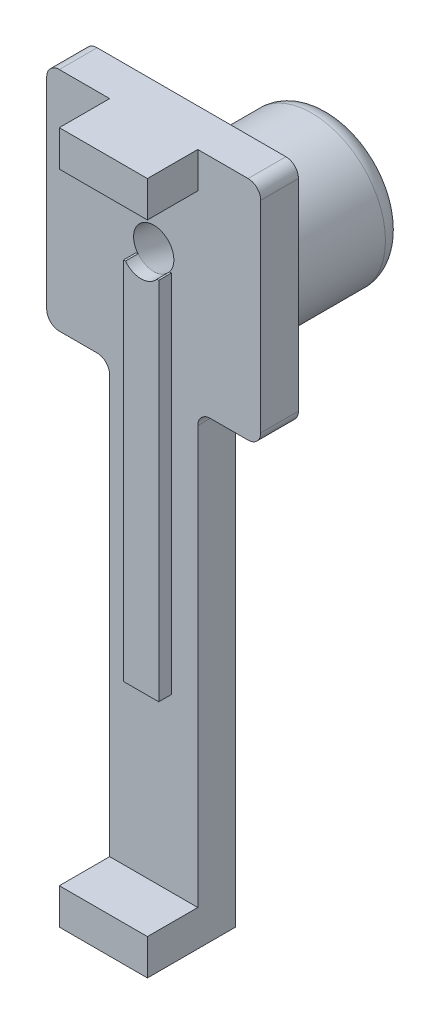
ISO-10303-21;
HEADER;
FILE_DESCRIPTION(('STEP AP214'),'2;1');
FILE_NAME('part.step','',(''),(''),'','','');
FILE_SCHEMA(('AUTOMOTIVE_DESIGN { 1 0 10303 214 1 1 1 1 }'));
ENDSEC;
DATA;
#1=APPLICATION_CONTEXT('core data for automotive mechanical design processes');
#2=APPLICATION_PROTOCOL_DEFINITION('international standard','automotive_design',2000,#1);
#3=PRODUCT_CONTEXT('',#1,'mechanical');
#4=PRODUCT('Part','Part','',(#3));
#5=PRODUCT_RELATED_PRODUCT_CATEGORY('part','',(#4));
#6=PRODUCT_DEFINITION_FORMATION('','',#4);
#7=PRODUCT_DEFINITION_CONTEXT('part definition',#1,'design');
#8=PRODUCT_DEFINITION('design','',#6,#7);
#9=PRODUCT_DEFINITION_SHAPE('','',#8);
#10=(LENGTH_UNIT() NAMED_UNIT(*) SI_UNIT(.MILLI.,.METRE.));
#11=(NAMED_UNIT(*) PLANE_ANGLE_UNIT() SI_UNIT($,.RADIAN.));
#12=(NAMED_UNIT(*) SI_UNIT($,.STERADIAN.) SOLID_ANGLE_UNIT());
#13=UNCERTAINTY_MEASURE_WITH_UNIT(LENGTH_MEASURE(1.E-05),#10,'distance_accuracy_value','');
#14=(GEOMETRIC_REPRESENTATION_CONTEXT(3) GLOBAL_UNCERTAINTY_ASSIGNED_CONTEXT((#13)) GLOBAL_UNIT_ASSIGNED_CONTEXT((#10,
#11,#12)) REPRESENTATION_CONTEXT('',''));
#15=CARTESIAN_POINT('',(0.,0.,0.));
#16=DIRECTION('',(0.,0.,1.));
#17=DIRECTION('',(1.,0.,0.));
#18=AXIS2_PLACEMENT_3D('',#15,#16,#17);
#19=CARTESIAN_POINT('',(1.4,26.9951042268699,4.));
#20=DIRECTION('',(0.,-1.,0.));
#21=DIRECTION('',(0.,0.,-1.));
#22=AXIS2_PLACEMENT_3D('',#19,#20,#21);
#23=PLANE('',#22);
#24=DIRECTION('',(-1.,0.,0.));
#25=VECTOR('',#24,1.);
#26=CARTESIAN_POINT('',(1.4,26.9951042268699,4.));
#27=LINE('',#26,#25);
#28=CARTESIAN_POINT('',(-1.24912299092202,26.9951042268699,4.));
#29=VERTEX_POINT('',#28);
#30=CARTESIAN_POINT('',(-1.4,26.9951042268699,4.));
#31=VERTEX_POINT('',#30);
#32=EDGE_CURVE('E244',#29,#31,#27,.T.);
#33=ORIENTED_EDGE('',*,*,#32,.F.);
#34=DIRECTION('',(0.,0.,-1.));
#35=VECTOR('',#34,1.);
#36=CARTESIAN_POINT('',(-1.24912299092202,26.9951042268699,13.));
#37=LINE('',#36,#35);
#38=CARTESIAN_POINT('',(-1.24912299092202,26.9951042268699,3.));
#39=VERTEX_POINT('',#38);
#40=EDGE_CURVE('E228',#29,#39,#37,.T.);
#41=ORIENTED_EDGE('',*,*,#40,.T.);
#42=DIRECTION('',(-1.,0.,0.));
#43=VECTOR('',#42,1.);
#44=CARTESIAN_POINT('',(1.4,26.9951042268699,3.));
#45=LINE('',#44,#43);
#46=CARTESIAN_POINT('',(-1.4,26.9951042268699,3.));
#47=VERTEX_POINT('',#46);
#48=EDGE_CURVE('E242',#39,#47,#45,.T.);
#49=ORIENTED_EDGE('',*,*,#48,.T.);
#50=DIRECTION('',(0.,0.,-1.));
#51=VECTOR('',#50,1.);
#52=CARTESIAN_POINT('',(-1.4,26.9951042268699,4.));
#53=LINE('',#52,#51);
#54=EDGE_CURVE('E285',#31,#47,#53,.T.);
#55=ORIENTED_EDGE('',*,*,#54,.F.);
#56=EDGE_LOOP('',(#33,#41,#49,#55));
#57=FACE_BOUND('',#56,.T.);
#58=ADVANCED_FACE('F50',(#57),#23,.F.);
#59=CARTESIAN_POINT('',(3.5,0.,3.));
#60=DIRECTION('',(-1.,0.,0.));
#61=DIRECTION('',(0.,0.,1.));
#62=AXIS2_PLACEMENT_3D('',#59,#60,#61);
#63=PLANE('',#62);
#64=DIRECTION('',(0.,1.,0.));
#65=VECTOR('',#64,1.);
#66=CARTESIAN_POINT('',(3.5,0.,0.));
#67=LINE('',#66,#65);
#68=CARTESIAN_POINT('',(3.5,-18.4548957731301,0.));
#69=VERTEX_POINT('',#68);
#70=CARTESIAN_POINT('',(3.5,17.5451042268699,0.));
#71=VERTEX_POINT('',#70);
#72=EDGE_CURVE('E304',#69,#71,#67,.T.);
#73=ORIENTED_EDGE('',*,*,#72,.T.);
#74=DIRECTION('',(0.,0.,-1.));
#75=VECTOR('',#74,1.);
#76=CARTESIAN_POINT('',(3.5,17.5451042268699,3.));
#77=LINE('',#76,#75);
#78=CARTESIAN_POINT('',(3.5,17.5451042268699,3.));
#79=VERTEX_POINT('',#78);
#80=EDGE_CURVE('E370',#71,#79,#77,.F.);
#81=ORIENTED_EDGE('',*,*,#80,.T.);
#82=DIRECTION('',(0.,1.,0.));
#83=VECTOR('',#82,1.);
#84=CARTESIAN_POINT('',(3.5,0.,3.));
#85=LINE('',#84,#83);
#86=CARTESIAN_POINT('',(3.5,-15.6048957731301,3.));
#87=VERTEX_POINT('',#86);
#88=EDGE_CURVE('E294',#87,#79,#85,.T.);
#89=ORIENTED_EDGE('',*,*,#88,.F.);
#90=DIRECTION('',(0.,0.,-1.));
#91=VECTOR('',#90,1.);
#92=CARTESIAN_POINT('',(3.5,-15.6048957731301,7.));
#93=LINE('',#92,#91);
#94=CARTESIAN_POINT('',(3.5,-15.6048957731301,7.));
#95=VERTEX_POINT('',#94);
#96=EDGE_CURVE('E610',#95,#87,#93,.T.);
#97=ORIENTED_EDGE('',*,*,#96,.F.);
#98=DIRECTION('',(0.,1.,0.));
#99=VECTOR('',#98,1.);
#100=CARTESIAN_POINT('',(3.5,-18.4548957731301,7.));
#101=LINE('',#100,#99);
#102=CARTESIAN_POINT('',(3.5,-18.4548957731301,7.));
#103=VERTEX_POINT('',#102);
#104=EDGE_CURVE('E594',#103,#95,#101,.T.);
#105=ORIENTED_EDGE('',*,*,#104,.F.);
#106=DIRECTION('',(0.,0.,-1.));
#107=VECTOR('',#106,1.);
#108=CARTESIAN_POINT('',(3.5,-18.4548957731301,3.));
#109=LINE('',#108,#107);
#110=EDGE_CURVE('E313',#103,#69,#109,.T.);
#111=ORIENTED_EDGE('',*,*,#110,.T.);
#112=EDGE_LOOP('',(#73,#81,#89,#97,#105,#111));
#113=FACE_BOUND('',#112,.T.);
#114=ADVANCED_FACE('F511',(#113),#63,.F.);
#115=DIRECTION('',(0.,-1.,0.));
#116=VECTOR('',#115,1.);
#117=CARTESIAN_POINT('',(3.5,36.5451042268699,3.));
#118=LINE('',#117,#116);
#119=CARTESIAN_POINT('',(3.5,36.5451042268699,3.));
#120=VERTEX_POINT('',#119);
#121=CARTESIAN_POINT('',(3.5,33.6951042268699,3.));
#122=VERTEX_POINT('',#121);
#123=EDGE_CURVE('E236',#120,#122,#118,.T.);
#124=ORIENTED_EDGE('',*,*,#123,.F.);
#125=DIRECTION('',(0.,0.,-1.));
#126=VECTOR('',#125,1.);
#127=CARTESIAN_POINT('',(3.5,36.5451042268699,3.));
#128=LINE('',#127,#126);
#129=CARTESIAN_POINT('',(3.5,36.5451042268699,7.));
#130=VERTEX_POINT('',#129);
#131=EDGE_CURVE('E310',#130,#120,#128,.T.);
#132=ORIENTED_EDGE('',*,*,#131,.F.);
#133=DIRECTION('',(0.,1.,0.));
#134=VECTOR('',#133,1.);
#135=CARTESIAN_POINT('',(3.5,36.5451042268699,7.));
#136=LINE('',#135,#134);
#137=CARTESIAN_POINT('',(3.5,33.6951042268699,7.));
#138=VERTEX_POINT('',#137);
#139=EDGE_CURVE('E619',#138,#130,#136,.T.);
#140=ORIENTED_EDGE('',*,*,#139,.F.);
#141=DIRECTION('',(0.,0.,-1.));
#142=VECTOR('',#141,1.);
#143=CARTESIAN_POINT('',(3.5,33.6951042268699,7.));
#144=LINE('',#143,#142);
#145=EDGE_CURVE('E625',#138,#122,#144,.T.);
#146=ORIENTED_EDGE('',*,*,#145,.T.);
#147=EDGE_LOOP('',(#124,#132,#140,#146));
#148=FACE_BOUND('',#147,.T.);
#149=ADVANCED_FACE('F515',(#148),#63,.F.);
#150=CARTESIAN_POINT('',(-3.5,0.,3.));
#151=DIRECTION('',(-1.,0.,0.));
#152=DIRECTION('',(0.,0.,1.));
#153=AXIS2_PLACEMENT_3D('',#150,#151,#152);
#154=PLANE('',#153);
#155=DIRECTION('',(0.,1.,0.));
#156=VECTOR('',#155,1.);
#157=CARTESIAN_POINT('',(-3.5,36.5451042268699,3.));
#158=LINE('',#157,#156);
#159=CARTESIAN_POINT('',(-3.5,33.6951042268699,3.));
#160=VERTEX_POINT('',#159);
#161=CARTESIAN_POINT('',(-3.5,36.5451042268699,3.));
#162=VERTEX_POINT('',#161);
#163=EDGE_CURVE('E317',#160,#162,#158,.T.);
#164=ORIENTED_EDGE('',*,*,#163,.F.);
#165=DIRECTION('',(0.,0.,-1.));
#166=VECTOR('',#165,1.);
#167=CARTESIAN_POINT('',(-3.5,33.6951042268699,7.));
#168=LINE('',#167,#166);
#169=CARTESIAN_POINT('',(-3.5,33.6951042268699,7.));
#170=VERTEX_POINT('',#169);
#171=EDGE_CURVE('E264',#170,#160,#168,.T.);
#172=ORIENTED_EDGE('',*,*,#171,.F.);
#173=DIRECTION('',(0.,-1.,0.));
#174=VECTOR('',#173,1.);
#175=CARTESIAN_POINT('',(-3.5,36.5451042268699,7.));
#176=LINE('',#175,#174);
#177=CARTESIAN_POINT('',(-3.5,36.5451042268699,7.));
#178=VERTEX_POINT('',#177);
#179=EDGE_CURVE('E614',#178,#170,#176,.T.);
#180=ORIENTED_EDGE('',*,*,#179,.F.);
#181=DIRECTION('',(0.,0.,-1.));
#182=VECTOR('',#181,1.);
#183=CARTESIAN_POINT('',(-3.5,36.5451042268699,3.));
#184=LINE('',#183,#182);
#185=EDGE_CURVE('E298',#178,#162,#184,.T.);
#186=ORIENTED_EDGE('',*,*,#185,.T.);
#187=EDGE_LOOP('',(#164,#172,#180,#186));
#188=FACE_BOUND('',#187,.T.);
#189=ADVANCED_FACE('F459',(#188),#154,.T.);
#190=CARTESIAN_POINT('',(0.,0.,3.));
#191=DIRECTION('',(0.,0.,1.));
#192=DIRECTION('',(1.,0.,0.));
#193=AXIS2_PLACEMENT_3D('',#190,#191,#192);
#194=PLANE('',#193);
#195=CARTESIAN_POINT('',(0.,27.9951042268699,3.));
#196=DIRECTION('',(0.,0.,1.));
#197=DIRECTION('',(1.,0.,0.));
#198=AXIS2_PLACEMENT_3D('',#195,#196,#197);
#199=CIRCLE('',#198,1.6);
#200=CARTESIAN_POINT('',(1.24876445430124,26.995104254588,3.));
#201=VERTEX_POINT('',#200);
#202=EDGE_CURVE('E54',#201,#39,#199,.T.);
#203=ORIENTED_EDGE('',*,*,#202,.F.);
#204=CARTESIAN_POINT('',(1.4,26.9951042268699,3.));
#205=VERTEX_POINT('',#204);
#206=EDGE_CURVE('E259',#205,#201,#45,.T.);
#207=ORIENTED_EDGE('',*,*,#206,.F.);
#208=DIRECTION('',(0.,1.,0.));
#209=VECTOR('',#208,1.);
#210=CARTESIAN_POINT('',(1.4,-2.00489577313014,3.));
#211=LINE('',#210,#209);
#212=CARTESIAN_POINT('',(1.4,-2.00489577313014,3.));
#213=VERTEX_POINT('',#212);
#214=EDGE_CURVE('E260',#213,#205,#211,.T.);
#215=ORIENTED_EDGE('',*,*,#214,.F.);
#216=DIRECTION('',(1.,0.,0.));
#217=VECTOR('',#216,1.);
#218=CARTESIAN_POINT('',(-1.4,-2.00489577313014,3.));
#219=LINE('',#218,#217);
#220=CARTESIAN_POINT('',(-1.4,-2.00489577313014,3.));
#221=VERTEX_POINT('',#220);
#222=EDGE_CURVE('E274',#221,#213,#219,.T.);
#223=ORIENTED_EDGE('',*,*,#222,.F.);
#224=DIRECTION('',(0.,-1.,0.));
#225=VECTOR('',#224,1.);
#226=CARTESIAN_POINT('',(-1.4,26.9951042268699,3.));
#227=LINE('',#226,#225);
#228=EDGE_CURVE('E257',#47,#221,#227,.T.);
#229=ORIENTED_EDGE('',*,*,#228,.F.);
#230=ORIENTED_EDGE('',*,*,#48,.F.);
#231=EDGE_LOOP('',(#203,#207,#215,#223,#229,#230));
#232=FACE_BOUND('',#231,.T.);
#233=DIRECTION('',(0.,1.,0.));
#234=VECTOR('',#233,1.);
#235=CARTESIAN_POINT('',(-8.5,36.5451042268699,3.));
#236=LINE('',#235,#234);
#237=CARTESIAN_POINT('',(-8.5,19.5451042268699,3.));
#238=VERTEX_POINT('',#237);
#239=CARTESIAN_POINT('',(-8.5,35.5451042268699,3.));
#240=VERTEX_POINT('',#239);
#241=EDGE_CURVE('E580',#238,#240,#236,.T.);
#242=ORIENTED_EDGE('',*,*,#241,.F.);
#243=CARTESIAN_POINT('',(-7.5,19.5451042268699,3.));
#244=DIRECTION('',(0.,0.,1.));
#245=DIRECTION('',(1.,0.,0.));
#246=AXIS2_PLACEMENT_3D('',#243,#244,#245);
#247=CIRCLE('',#246,1.);
#248=CARTESIAN_POINT('',(-7.5,18.5451042268699,3.));
#249=VERTEX_POINT('',#248);
#250=EDGE_CURVE('E346',#238,#249,#247,.T.);
#251=ORIENTED_EDGE('',*,*,#250,.T.);
#252=DIRECTION('',(1.,0.,0.));
#253=VECTOR('',#252,1.);
#254=CARTESIAN_POINT('',(-8.5,18.5451042268699,3.));
#255=LINE('',#254,#253);
#256=CARTESIAN_POINT('',(-4.5,18.5451042268699,3.));
#257=VERTEX_POINT('',#256);
#258=EDGE_CURVE('E587',#249,#257,#255,.T.);
#259=ORIENTED_EDGE('',*,*,#258,.T.);
#260=CARTESIAN_POINT('',(-4.5,17.5451042268699,3.));
#261=DIRECTION('',(0.,0.,1.));
#262=DIRECTION('',(1.,0.,0.));
#263=AXIS2_PLACEMENT_3D('',#260,#261,#262);
#264=CIRCLE('',#263,1.);
#265=CARTESIAN_POINT('',(-3.5,17.5451042268699,3.));
#266=VERTEX_POINT('',#265);
#267=EDGE_CURVE('E372',#257,#266,#264,.F.);
#268=ORIENTED_EDGE('',*,*,#267,.T.);
#269=DIRECTION('',(0.,1.,0.));
#270=VECTOR('',#269,1.);
#271=CARTESIAN_POINT('',(-3.5,0.,3.));
#272=LINE('',#271,#270);
#273=CARTESIAN_POINT('',(-3.5,-15.6048957731301,3.));
#274=VERTEX_POINT('',#273);
#275=EDGE_CURVE('E291',#274,#266,#272,.T.);
#276=ORIENTED_EDGE('',*,*,#275,.F.);
#277=DIRECTION('',(-1.,0.,0.));
#278=VECTOR('',#277,1.);
#279=CARTESIAN_POINT('',(3.5,-15.6048957731301,3.));
#280=LINE('',#279,#278);
#281=EDGE_CURVE('E593',#87,#274,#280,.T.);
#282=ORIENTED_EDGE('',*,*,#281,.F.);
#283=ORIENTED_EDGE('',*,*,#88,.T.);
#284=CARTESIAN_POINT('',(4.5,17.5451042268699,3.));
#285=DIRECTION('',(0.,0.,1.));
#286=DIRECTION('',(1.,0.,0.));
#287=AXIS2_PLACEMENT_3D('',#284,#285,#286);
#288=CIRCLE('',#287,1.);
#289=CARTESIAN_POINT('',(4.5,18.5451042268699,3.));
#290=VERTEX_POINT('',#289);
#291=EDGE_CURVE('E12',#79,#290,#288,.F.);
#292=ORIENTED_EDGE('',*,*,#291,.T.);
#293=DIRECTION('',(-1.,0.,0.));
#294=VECTOR('',#293,1.);
#295=CARTESIAN_POINT('',(8.5,18.5451042268699,3.));
#296=LINE('',#295,#294);
#297=CARTESIAN_POINT('',(7.5,18.5451042268699,3.));
#298=VERTEX_POINT('',#297);
#299=EDGE_CURVE('E564',#298,#290,#296,.T.);
#300=ORIENTED_EDGE('',*,*,#299,.F.);
#301=CARTESIAN_POINT('',(7.5,19.5451042268699,3.));
#302=DIRECTION('',(0.,0.,1.));
#303=DIRECTION('',(1.,0.,0.));
#304=AXIS2_PLACEMENT_3D('',#301,#302,#303);
#305=CIRCLE('',#304,1.);
#306=CARTESIAN_POINT('',(8.5,19.5451042268699,3.));
#307=VERTEX_POINT('',#306);
#308=EDGE_CURVE('E340',#298,#307,#305,.T.);
#309=ORIENTED_EDGE('',*,*,#308,.T.);
#310=DIRECTION('',(0.,-1.,0.));
#311=VECTOR('',#310,1.);
#312=CARTESIAN_POINT('',(8.5,36.5451042268699,3.));
#313=LINE('',#312,#311);
#314=CARTESIAN_POINT('',(8.5,35.5451042268699,3.));
#315=VERTEX_POINT('',#314);
#316=EDGE_CURVE('E562',#315,#307,#313,.T.);
#317=ORIENTED_EDGE('',*,*,#316,.F.);
#318=CARTESIAN_POINT('',(7.5,35.5451042268699,3.));
#319=DIRECTION('',(0.,0.,1.));
#320=DIRECTION('',(1.,0.,0.));
#321=AXIS2_PLACEMENT_3D('',#318,#319,#320);
#322=CIRCLE('',#321,1.);
#323=CARTESIAN_POINT('',(7.5,36.5451042268699,3.));
#324=VERTEX_POINT('',#323);
#325=EDGE_CURVE('E342',#315,#324,#322,.T.);
#326=ORIENTED_EDGE('',*,*,#325,.T.);
#327=DIRECTION('',(-1.,0.,0.));
#328=VECTOR('',#327,1.);
#329=CARTESIAN_POINT('',(8.5,36.5451042268699,3.));
#330=LINE('',#329,#328);
#331=EDGE_CURVE('E575',#324,#120,#330,.T.);
#332=ORIENTED_EDGE('',*,*,#331,.T.);
#333=ORIENTED_EDGE('',*,*,#123,.T.);
#334=DIRECTION('',(1.,0.,0.));
#335=VECTOR('',#334,1.);
#336=CARTESIAN_POINT('',(-3.5,33.6951042268699,3.));
#337=LINE('',#336,#335);
#338=EDGE_CURVE('E613',#160,#122,#337,.T.);
#339=ORIENTED_EDGE('',*,*,#338,.F.);
#340=ORIENTED_EDGE('',*,*,#163,.T.);
#341=DIRECTION('',(1.,0.,0.));
#342=VECTOR('',#341,1.);
#343=CARTESIAN_POINT('',(-8.5,36.5451042268699,3.));
#344=LINE('',#343,#342);
#345=CARTESIAN_POINT('',(-7.5,36.5451042268699,3.));
#346=VERTEX_POINT('',#345);
#347=EDGE_CURVE('E583',#346,#162,#344,.T.);
#348=ORIENTED_EDGE('',*,*,#347,.F.);
#349=CARTESIAN_POINT('',(-7.5,35.5451042268699,3.));
#350=DIRECTION('',(0.,0.,1.));
#351=DIRECTION('',(1.,0.,0.));
#352=AXIS2_PLACEMENT_3D('',#349,#350,#351);
#353=CIRCLE('',#352,1.);
#354=EDGE_CURVE('E344',#346,#240,#353,.T.);
#355=ORIENTED_EDGE('',*,*,#354,.T.);
#356=EDGE_LOOP('',(#242,#251,#259,#268,#276,#282,#283,#292,#300,#309,#317,#326,#332,#333,#339,
#340,#348,#355));
#357=FACE_BOUND('',#356,.T.);
#358=ADVANCED_FACE('F254',(#232,#357),#194,.T.);
#359=ORIENTED_EDGE('',*,*,#275,.T.);
#360=DIRECTION('',(0.,0.,1.));
#361=VECTOR('',#360,1.);
#362=CARTESIAN_POINT('',(-3.5,17.5451042268699,2.99999999999998));
#363=LINE('',#362,#361);
#364=CARTESIAN_POINT('',(-3.5,17.5451042268699,0.));
#365=VERTEX_POINT('',#364);
#366=EDGE_CURVE('E332',#266,#365,#363,.F.);
#367=ORIENTED_EDGE('',*,*,#366,.T.);
#368=DIRECTION('',(0.,1.,0.));
#369=VECTOR('',#368,1.);
#370=CARTESIAN_POINT('',(-3.5,0.,0.));
#371=LINE('',#370,#369);
#372=CARTESIAN_POINT('',(-3.5,-18.4548957731301,0.));
#373=VERTEX_POINT('',#372);
#374=EDGE_CURVE('E290',#373,#365,#371,.T.);
#375=ORIENTED_EDGE('',*,*,#374,.F.);
#376=DIRECTION('',(0.,0.,-1.));
#377=VECTOR('',#376,1.);
#378=CARTESIAN_POINT('',(-3.5,-18.4548957731301,3.));
#379=LINE('',#378,#377);
#380=CARTESIAN_POINT('',(-3.5,-18.4548957731301,7.));
#381=VERTEX_POINT('',#380);
#382=EDGE_CURVE('E315',#381,#373,#379,.T.);
#383=ORIENTED_EDGE('',*,*,#382,.F.);
#384=DIRECTION('',(0.,-1.,0.));
#385=VECTOR('',#384,1.);
#386=CARTESIAN_POINT('',(-3.5,-18.4548957731301,7.));
#387=LINE('',#386,#385);
#388=CARTESIAN_POINT('',(-3.5,-15.6048957731301,7.));
#389=VERTEX_POINT('',#388);
#390=EDGE_CURVE('E599',#389,#381,#387,.T.);
#391=ORIENTED_EDGE('',*,*,#390,.F.);
#392=DIRECTION('',(0.,0.,-1.));
#393=VECTOR('',#392,1.);
#394=CARTESIAN_POINT('',(-3.5,-15.6048957731301,7.));
#395=LINE('',#394,#393);
#396=EDGE_CURVE('E605',#389,#274,#395,.T.);
#397=ORIENTED_EDGE('',*,*,#396,.T.);
#398=EDGE_LOOP('',(#359,#367,#375,#383,#391,#397));
#399=FACE_BOUND('',#398,.T.);
#400=ADVANCED_FACE('F458',(#399),#154,.T.);
#401=CARTESIAN_POINT('',(0.,-18.4548957731301,3.));
#402=DIRECTION('',(0.,-1.,0.));
#403=DIRECTION('',(0.,0.,-1.));
#404=AXIS2_PLACEMENT_3D('',#401,#402,#403);
#405=PLANE('',#404);
#406=DIRECTION('',(-1.,0.,0.));
#407=VECTOR('',#406,1.);
#408=CARTESIAN_POINT('',(0.,-18.4548957731301,0.));
#409=LINE('',#408,#407);
#410=EDGE_CURVE('E301',#69,#373,#409,.T.);
#411=ORIENTED_EDGE('',*,*,#410,.F.);
#412=ORIENTED_EDGE('',*,*,#110,.F.);
#413=DIRECTION('',(1.,0.,0.));
#414=VECTOR('',#413,1.);
#415=CARTESIAN_POINT('',(3.5,-18.4548957731301,7.));
#416=LINE('',#415,#414);
#417=EDGE_CURVE('E602',#381,#103,#416,.T.);
#418=ORIENTED_EDGE('',*,*,#417,.F.);
#419=ORIENTED_EDGE('',*,*,#382,.T.);
#420=EDGE_LOOP('',(#411,#412,#418,#419));
#421=FACE_BOUND('',#420,.T.);
#422=ADVANCED_FACE('F524',(#421),#405,.T.);
#423=CARTESIAN_POINT('',(0.,36.5451042268699,3.));
#424=DIRECTION('',(0.,-1.,0.));
#425=DIRECTION('',(0.,0.,-1.));
#426=AXIS2_PLACEMENT_3D('',#423,#424,#425);
#427=PLANE('',#426);
#428=DIRECTION('',(-1.,0.,0.));
#429=VECTOR('',#428,1.);
#430=CARTESIAN_POINT('',(0.,36.5451042268699,0.));
#431=LINE('',#430,#429);
#432=CARTESIAN_POINT('',(7.5,36.5451042268699,0.));
#433=VERTEX_POINT('',#432);
#434=CARTESIAN_POINT('',(-7.5,36.5451042268699,0.));
#435=VERTEX_POINT('',#434);
#436=EDGE_CURVE('E295',#433,#435,#431,.T.);
#437=ORIENTED_EDGE('',*,*,#436,.T.);
#438=DIRECTION('',(0.,0.,-1.));
#439=VECTOR('',#438,1.);
#440=CARTESIAN_POINT('',(-7.5,36.5451042268699,3.));
#441=LINE('',#440,#439);
#442=EDGE_CURVE('E358',#435,#346,#441,.F.);
#443=ORIENTED_EDGE('',*,*,#442,.T.);
#444=ORIENTED_EDGE('',*,*,#347,.T.);
#445=ORIENTED_EDGE('',*,*,#185,.F.);
#446=DIRECTION('',(-1.,0.,0.));
#447=VECTOR('',#446,1.);
#448=CARTESIAN_POINT('',(-3.5,36.5451042268699,7.));
#449=LINE('',#448,#447);
#450=EDGE_CURVE('E622',#130,#178,#449,.T.);
#451=ORIENTED_EDGE('',*,*,#450,.F.);
#452=ORIENTED_EDGE('',*,*,#131,.T.);
#453=ORIENTED_EDGE('',*,*,#331,.F.);
#454=DIRECTION('',(0.,0.,1.));
#455=VECTOR('',#454,1.);
#456=CARTESIAN_POINT('',(7.5,36.5451042268699,0.));
#457=LINE('',#456,#455);
#458=EDGE_CURVE('E356',#324,#433,#457,.F.);
#459=ORIENTED_EDGE('',*,*,#458,.T.);
#460=EDGE_LOOP('',(#437,#443,#444,#445,#451,#452,#453,#459));
#461=FACE_BOUND('',#460,.T.);
#462=ADVANCED_FACE('F523',(#461),#427,.F.);
#463=CARTESIAN_POINT('',(0.,0.,0.));
#464=DIRECTION('',(0.,0.,1.));
#465=DIRECTION('',(1.,0.,0.));
#466=AXIS2_PLACEMENT_3D('',#463,#464,#465);
#467=PLANE('',#466);
#468=CARTESIAN_POINT('',(0.,25.1701042268699,0.));
#469=DIRECTION('',(0.,0.,1.));
#470=DIRECTION('',(1.,0.,0.));
#471=AXIS2_PLACEMENT_3D('',#468,#469,#470);
#472=CIRCLE('',#471,5.85);
#473=CARTESIAN_POINT('',(5.85,25.1701042268699,0.));
#474=VERTEX_POINT('',#473);
#475=EDGE_CURVE('E318',#474,#474,#472,.F.);
#476=ORIENTED_EDGE('',*,*,#475,.F.);
#477=EDGE_LOOP('',(#476));
#478=FACE_BOUND('',#477,.T.);
#479=DIRECTION('',(1.,0.,0.));
#480=VECTOR('',#479,1.);
#481=CARTESIAN_POINT('',(-8.5,18.5451042268699,0.));
#482=LINE('',#481,#480);
#483=CARTESIAN_POINT('',(-7.5,18.5451042268699,0.));
#484=VERTEX_POINT('',#483);
#485=CARTESIAN_POINT('',(-4.5,18.5451042268699,0.));
#486=VERTEX_POINT('',#485);
#487=EDGE_CURVE('E590',#484,#486,#482,.T.);
#488=ORIENTED_EDGE('',*,*,#487,.F.);
#489=CARTESIAN_POINT('',(-7.5,19.5451042268699,0.));
#490=DIRECTION('',(0.,0.,1.));
#491=DIRECTION('',(1.,0.,0.));
#492=AXIS2_PLACEMENT_3D('',#489,#490,#491);
#493=CIRCLE('',#492,1.);
#494=CARTESIAN_POINT('',(-8.5,19.5451042268699,0.));
#495=VERTEX_POINT('',#494);
#496=EDGE_CURVE('E354',#484,#495,#493,.F.);
#497=ORIENTED_EDGE('',*,*,#496,.T.);
#498=DIRECTION('',(0.,-1.,0.));
#499=VECTOR('',#498,1.);
#500=CARTESIAN_POINT('',(-8.5,36.5451042268699,0.));
#501=LINE('',#500,#499);
#502=CARTESIAN_POINT('',(-8.5,35.5451042268699,0.));
#503=VERTEX_POINT('',#502);
#504=EDGE_CURVE('E577',#503,#495,#501,.T.);
#505=ORIENTED_EDGE('',*,*,#504,.F.);
#506=CARTESIAN_POINT('',(-7.5,35.5451042268699,0.));
#507=DIRECTION('',(0.,0.,1.));
#508=DIRECTION('',(1.,0.,0.));
#509=AXIS2_PLACEMENT_3D('',#506,#507,#508);
#510=CIRCLE('',#509,1.);
#511=EDGE_CURVE('E352',#503,#435,#510,.F.);
#512=ORIENTED_EDGE('',*,*,#511,.T.);
#513=ORIENTED_EDGE('',*,*,#436,.F.);
#514=CARTESIAN_POINT('',(7.5,35.5451042268699,0.));
#515=DIRECTION('',(0.,0.,1.));
#516=DIRECTION('',(1.,0.,0.));
#517=AXIS2_PLACEMENT_3D('',#514,#515,#516);
#518=CIRCLE('',#517,1.);
#519=CARTESIAN_POINT('',(8.5,35.5451042268699,0.));
#520=VERTEX_POINT('',#519);
#521=EDGE_CURVE('E350',#433,#520,#518,.F.);
#522=ORIENTED_EDGE('',*,*,#521,.T.);
#523=DIRECTION('',(0.,1.,0.));
#524=VECTOR('',#523,1.);
#525=CARTESIAN_POINT('',(8.5,18.5451042268699,0.));
#526=LINE('',#525,#524);
#527=CARTESIAN_POINT('',(8.5,19.5451042268699,0.));
#528=VERTEX_POINT('',#527);
#529=EDGE_CURVE('E569',#528,#520,#526,.T.);
#530=ORIENTED_EDGE('',*,*,#529,.F.);
#531=CARTESIAN_POINT('',(7.5,19.5451042268699,0.));
#532=DIRECTION('',(0.,0.,1.));
#533=DIRECTION('',(1.,0.,0.));
#534=AXIS2_PLACEMENT_3D('',#531,#532,#533);
#535=CIRCLE('',#534,1.);
#536=CARTESIAN_POINT('',(7.5,18.5451042268699,0.));
#537=VERTEX_POINT('',#536);
#538=EDGE_CURVE('E348',#528,#537,#535,.F.);
#539=ORIENTED_EDGE('',*,*,#538,.T.);
#540=DIRECTION('',(-1.,0.,0.));
#541=VECTOR('',#540,1.);
#542=CARTESIAN_POINT('',(8.5,18.5451042268699,0.));
#543=LINE('',#542,#541);
#544=CARTESIAN_POINT('',(4.5,18.5451042268699,0.));
#545=VERTEX_POINT('',#544);
#546=EDGE_CURVE('E568',#537,#545,#543,.T.);
#547=ORIENTED_EDGE('',*,*,#546,.T.);
#548=CARTESIAN_POINT('',(4.5,17.5451042268699,0.));
#549=DIRECTION('',(0.,0.,1.));
#550=DIRECTION('',(1.,0.,0.));
#551=AXIS2_PLACEMENT_3D('',#548,#549,#550);
#552=CIRCLE('',#551,1.);
#553=EDGE_CURVE('E60',#545,#71,#552,.T.);
#554=ORIENTED_EDGE('',*,*,#553,.T.);
#555=ORIENTED_EDGE('',*,*,#72,.F.);
#556=ORIENTED_EDGE('',*,*,#410,.T.);
#557=ORIENTED_EDGE('',*,*,#374,.T.);
#558=CARTESIAN_POINT('',(-4.5,17.5451042268699,0.));
#559=DIRECTION('',(0.,0.,1.));
#560=DIRECTION('',(1.,0.,0.));
#561=AXIS2_PLACEMENT_3D('',#558,#559,#560);
#562=CIRCLE('',#561,1.);
#563=EDGE_CURVE('E374',#365,#486,#562,.T.);
#564=ORIENTED_EDGE('',*,*,#563,.T.);
#565=EDGE_LOOP('',(#488,#497,#505,#512,#513,#522,#530,#539,#547,#554,#555,#556,#557,#564));
#566=FACE_BOUND('',#565,.T.);
#567=ADVANCED_FACE('F453',(#478,#566),#467,.F.);
#568=CARTESIAN_POINT('',(1.4,-2.00489577313014,4.));
#569=DIRECTION('',(-1.,0.,0.));
#570=DIRECTION('',(0.,-1.,0.));
#571=AXIS2_PLACEMENT_3D('',#568,#569,#570);
#572=PLANE('',#571);
#573=ORIENTED_EDGE('',*,*,#214,.T.);
#574=DIRECTION('',(0.,0.,-1.));
#575=VECTOR('',#574,1.);
#576=CARTESIAN_POINT('',(1.4,26.9951042268699,4.));
#577=LINE('',#576,#575);
#578=CARTESIAN_POINT('',(1.4,26.9951042268699,4.));
#579=VERTEX_POINT('',#578);
#580=EDGE_CURVE('E287',#579,#205,#577,.T.);
#581=ORIENTED_EDGE('',*,*,#580,.F.);
#582=DIRECTION('',(0.,1.,0.));
#583=VECTOR('',#582,1.);
#584=CARTESIAN_POINT('',(1.4,-2.00489577313014,4.));
#585=LINE('',#584,#583);
#586=CARTESIAN_POINT('',(1.4,-2.00489577313014,4.));
#587=VERTEX_POINT('',#586);
#588=EDGE_CURVE('E277',#587,#579,#585,.T.);
#589=ORIENTED_EDGE('',*,*,#588,.F.);
#590=DIRECTION('',(0.,0.,-1.));
#591=VECTOR('',#590,1.);
#592=CARTESIAN_POINT('',(1.4,-2.00489577313014,4.));
#593=LINE('',#592,#591);
#594=EDGE_CURVE('E278',#587,#213,#593,.T.);
#595=ORIENTED_EDGE('',*,*,#594,.T.);
#596=EDGE_LOOP('',(#573,#581,#589,#595));
#597=FACE_BOUND('',#596,.T.);
#598=ADVANCED_FACE('F449',(#597),#572,.F.);
#599=ORIENTED_EDGE('',*,*,#206,.T.);
#600=DIRECTION('',(0.,0.,-1.));
#601=VECTOR('',#600,1.);
#602=CARTESIAN_POINT('',(1.24876445430124,26.995104254588,13.));
#603=LINE('',#602,#601);
#604=CARTESIAN_POINT('',(1.24876445430124,26.995104254588,4.));
#605=VERTEX_POINT('',#604);
#606=EDGE_CURVE('E231',#605,#201,#603,.T.);
#607=ORIENTED_EDGE('',*,*,#606,.F.);
#608=EDGE_CURVE('E634',#579,#605,#27,.T.);
#609=ORIENTED_EDGE('',*,*,#608,.F.);
#610=ORIENTED_EDGE('',*,*,#580,.T.);
#611=EDGE_LOOP('',(#599,#607,#609,#610));
#612=FACE_BOUND('',#611,.T.);
#613=ADVANCED_FACE('F445',(#612),#23,.F.);
#614=CARTESIAN_POINT('',(-1.4,26.9951042268699,4.));
#615=DIRECTION('',(1.,0.,0.));
#616=DIRECTION('',(0.,0.,-1.));
#617=AXIS2_PLACEMENT_3D('',#614,#615,#616);
#618=PLANE('',#617);
#619=ORIENTED_EDGE('',*,*,#228,.T.);
#620=DIRECTION('',(0.,0.,-1.));
#621=VECTOR('',#620,1.);
#622=CARTESIAN_POINT('',(-1.4,-2.00489577313014,4.));
#623=LINE('',#622,#621);
#624=CARTESIAN_POINT('',(-1.4,-2.00489577313014,4.));
#625=VERTEX_POINT('',#624);
#626=EDGE_CURVE('E281',#625,#221,#623,.T.);
#627=ORIENTED_EDGE('',*,*,#626,.F.);
#628=DIRECTION('',(0.,-1.,0.));
#629=VECTOR('',#628,1.);
#630=CARTESIAN_POINT('',(-1.4,26.9951042268699,4.));
#631=LINE('',#630,#629);
#632=EDGE_CURVE('E637',#31,#625,#631,.T.);
#633=ORIENTED_EDGE('',*,*,#632,.F.);
#634=ORIENTED_EDGE('',*,*,#54,.T.);
#635=EDGE_LOOP('',(#619,#627,#633,#634));
#636=FACE_BOUND('',#635,.T.);
#637=ADVANCED_FACE('F441',(#636),#618,.F.);
#638=CARTESIAN_POINT('',(-1.4,-2.00489577313014,4.));
#639=DIRECTION('',(0.,1.,0.));
#640=DIRECTION('',(0.,0.,1.));
#641=AXIS2_PLACEMENT_3D('',#638,#639,#640);
#642=PLANE('',#641);
#643=ORIENTED_EDGE('',*,*,#222,.T.);
#644=ORIENTED_EDGE('',*,*,#594,.F.);
#645=DIRECTION('',(1.,0.,0.));
#646=VECTOR('',#645,1.);
#647=CARTESIAN_POINT('',(-1.4,-2.00489577313014,4.));
#648=LINE('',#647,#646);
#649=EDGE_CURVE('E282',#625,#587,#648,.T.);
#650=ORIENTED_EDGE('',*,*,#649,.F.);
#651=ORIENTED_EDGE('',*,*,#626,.T.);
#652=EDGE_LOOP('',(#643,#644,#650,#651));
#653=FACE_BOUND('',#652,.T.);
#654=ADVANCED_FACE('F437',(#653),#642,.F.);
#655=CARTESIAN_POINT('',(0.,0.,4.));
#656=DIRECTION('',(0.,0.,1.));
#657=DIRECTION('',(1.,0.,0.));
#658=AXIS2_PLACEMENT_3D('',#655,#656,#657);
#659=PLANE('',#658);
#660=CARTESIAN_POINT('',(-0.000179279407001441,27.9951042394237,4.));
#661=DIRECTION('',(0.,0.,1.));
#662=DIRECTION('',(1.,0.,0.));
#663=AXIS2_PLACEMENT_3D('',#660,#661,#662);
#664=CIRCLE('',#663,1.59995638054309);
#665=EDGE_CURVE('E473',#29,#605,#664,.T.);
#666=ORIENTED_EDGE('',*,*,#665,.F.);
#667=ORIENTED_EDGE('',*,*,#32,.T.);
#668=ORIENTED_EDGE('',*,*,#632,.T.);
#669=ORIENTED_EDGE('',*,*,#649,.T.);
#670=ORIENTED_EDGE('',*,*,#588,.T.);
#671=ORIENTED_EDGE('',*,*,#608,.T.);
#672=EDGE_LOOP('',(#666,#667,#668,#669,#670,#671));
#673=FACE_BOUND('',#672,.T.);
#674=ADVANCED_FACE('F433',(#673),#659,.T.);
#675=CARTESIAN_POINT('',(-3.5,33.6951042268699,7.));
#676=DIRECTION('',(0.,1.,0.));
#677=DIRECTION('',(0.,0.,1.));
#678=AXIS2_PLACEMENT_3D('',#675,#676,#677);
#679=PLANE('',#678);
#680=ORIENTED_EDGE('',*,*,#338,.T.);
#681=ORIENTED_EDGE('',*,*,#145,.F.);
#682=DIRECTION('',(1.,0.,0.));
#683=VECTOR('',#682,1.);
#684=CARTESIAN_POINT('',(-3.5,33.6951042268699,7.));
#685=LINE('',#684,#683);
#686=EDGE_CURVE('E617',#170,#138,#685,.T.);
#687=ORIENTED_EDGE('',*,*,#686,.F.);
#688=ORIENTED_EDGE('',*,*,#171,.T.);
#689=EDGE_LOOP('',(#680,#681,#687,#688));
#690=FACE_BOUND('',#689,.T.);
#691=ADVANCED_FACE('F429',(#690),#679,.F.);
#692=CARTESIAN_POINT('',(0.,0.,7.));
#693=DIRECTION('',(0.,0.,1.));
#694=DIRECTION('',(1.,0.,0.));
#695=AXIS2_PLACEMENT_3D('',#692,#693,#694);
#696=PLANE('',#695);
#697=ORIENTED_EDGE('',*,*,#179,.T.);
#698=ORIENTED_EDGE('',*,*,#686,.T.);
#699=ORIENTED_EDGE('',*,*,#139,.T.);
#700=ORIENTED_EDGE('',*,*,#450,.T.);
#701=EDGE_LOOP('',(#697,#698,#699,#700));
#702=FACE_BOUND('',#701,.T.);
#703=ADVANCED_FACE('F425',(#702),#696,.T.);
#704=CARTESIAN_POINT('',(3.5,-15.6048957731301,7.));
#705=DIRECTION('',(0.,-1.,0.));
#706=DIRECTION('',(1.,0.,0.));
#707=AXIS2_PLACEMENT_3D('',#704,#705,#706);
#708=PLANE('',#707);
#709=ORIENTED_EDGE('',*,*,#281,.T.);
#710=ORIENTED_EDGE('',*,*,#396,.F.);
#711=DIRECTION('',(-1.,0.,0.));
#712=VECTOR('',#711,1.);
#713=CARTESIAN_POINT('',(3.5,-15.6048957731301,7.));
#714=LINE('',#713,#712);
#715=EDGE_CURVE('E597',#95,#389,#714,.T.);
#716=ORIENTED_EDGE('',*,*,#715,.F.);
#717=ORIENTED_EDGE('',*,*,#96,.T.);
#718=EDGE_LOOP('',(#709,#710,#716,#717));
#719=FACE_BOUND('',#718,.T.);
#720=ADVANCED_FACE('F421',(#719),#708,.F.);
#721=CARTESIAN_POINT('',(0.,0.,7.));
#722=DIRECTION('',(0.,0.,1.));
#723=DIRECTION('',(1.,0.,0.));
#724=AXIS2_PLACEMENT_3D('',#721,#722,#723);
#725=PLANE('',#724);
#726=ORIENTED_EDGE('',*,*,#104,.T.);
#727=ORIENTED_EDGE('',*,*,#715,.T.);
#728=ORIENTED_EDGE('',*,*,#390,.T.);
#729=ORIENTED_EDGE('',*,*,#417,.T.);
#730=EDGE_LOOP('',(#726,#727,#728,#729));
#731=FACE_BOUND('',#730,.T.);
#732=ADVANCED_FACE('F417',(#731),#725,.T.);
#733=CARTESIAN_POINT('',(-8.5,18.5451042268699,0.));
#734=DIRECTION('',(0.,1.,0.));
#735=DIRECTION('',(0.,0.,1.));
#736=AXIS2_PLACEMENT_3D('',#733,#734,#735);
#737=PLANE('',#736);
#738=ORIENTED_EDGE('',*,*,#487,.T.);
#739=DIRECTION('',(0.,0.,1.));
#740=VECTOR('',#739,1.);
#741=CARTESIAN_POINT('',(-4.5,18.5451042268699,0.));
#742=LINE('',#741,#740);
#743=EDGE_CURVE('E329',#486,#257,#742,.T.);
#744=ORIENTED_EDGE('',*,*,#743,.T.);
#745=ORIENTED_EDGE('',*,*,#258,.F.);
#746=DIRECTION('',(0.,0.,1.));
#747=VECTOR('',#746,1.);
#748=CARTESIAN_POINT('',(-7.5,18.5451042268699,0.));
#749=LINE('',#748,#747);
#750=EDGE_CURVE('E327',#249,#484,#749,.F.);
#751=ORIENTED_EDGE('',*,*,#750,.T.);
#752=EDGE_LOOP('',(#738,#744,#745,#751));
#753=FACE_BOUND('',#752,.T.);
#754=ADVANCED_FACE('F413',(#753),#737,.F.);
#755=CARTESIAN_POINT('',(-8.5,0.,0.));
#756=DIRECTION('',(-1.,0.,0.));
#757=DIRECTION('',(0.,0.,1.));
#758=AXIS2_PLACEMENT_3D('',#755,#756,#757);
#759=PLANE('',#758);
#760=ORIENTED_EDGE('',*,*,#504,.T.);
#761=DIRECTION('',(0.,0.,1.));
#762=VECTOR('',#761,1.);
#763=CARTESIAN_POINT('',(-8.5,19.5451042268699,3.));
#764=LINE('',#763,#762);
#765=EDGE_CURVE('E337',#495,#238,#764,.T.);
#766=ORIENTED_EDGE('',*,*,#765,.T.);
#767=ORIENTED_EDGE('',*,*,#241,.T.);
#768=DIRECTION('',(0.,0.,-1.));
#769=VECTOR('',#768,1.);
#770=CARTESIAN_POINT('',(-8.5,35.5451042268699,0.));
#771=LINE('',#770,#769);
#772=EDGE_CURVE('E334',#240,#503,#771,.T.);
#773=ORIENTED_EDGE('',*,*,#772,.T.);
#774=EDGE_LOOP('',(#760,#766,#767,#773));
#775=FACE_BOUND('',#774,.T.);
#776=ADVANCED_FACE('F409',(#775),#759,.T.);
#777=CARTESIAN_POINT('',(8.5,18.5451042268699,3.));
#778=DIRECTION('',(0.,1.,0.));
#779=DIRECTION('',(0.,0.,1.));
#780=AXIS2_PLACEMENT_3D('',#777,#778,#779);
#781=PLANE('',#780);
#782=ORIENTED_EDGE('',*,*,#546,.F.);
#783=DIRECTION('',(0.,0.,-1.));
#784=VECTOR('',#783,1.);
#785=CARTESIAN_POINT('',(7.5,18.5451042268699,3.));
#786=LINE('',#785,#784);
#787=EDGE_CURVE('E368',#537,#298,#786,.F.);
#788=ORIENTED_EDGE('',*,*,#787,.T.);
#789=ORIENTED_EDGE('',*,*,#299,.T.);
#790=DIRECTION('',(0.,0.,-1.));
#791=VECTOR('',#790,1.);
#792=CARTESIAN_POINT('',(4.5,18.5451042268699,0.));
#793=LINE('',#792,#791);
#794=EDGE_CURVE('E366',#290,#545,#793,.T.);
#795=ORIENTED_EDGE('',*,*,#794,.T.);
#796=EDGE_LOOP('',(#782,#788,#789,#795));
#797=FACE_BOUND('',#796,.T.);
#798=ADVANCED_FACE('F405',(#797),#781,.F.);
#799=CARTESIAN_POINT('',(8.5,0.,0.));
#800=DIRECTION('',(1.,0.,0.));
#801=DIRECTION('',(0.,0.,-1.));
#802=AXIS2_PLACEMENT_3D('',#799,#800,#801);
#803=PLANE('',#802);
#804=ORIENTED_EDGE('',*,*,#529,.T.);
#805=DIRECTION('',(0.,0.,1.));
#806=VECTOR('',#805,1.);
#807=CARTESIAN_POINT('',(8.5,35.5451042268699,3.));
#808=LINE('',#807,#806);
#809=EDGE_CURVE('E363',#520,#315,#808,.T.);
#810=ORIENTED_EDGE('',*,*,#809,.T.);
#811=ORIENTED_EDGE('',*,*,#316,.T.);
#812=DIRECTION('',(0.,0.,-1.));
#813=VECTOR('',#812,1.);
#814=CARTESIAN_POINT('',(8.5,19.5451042268699,0.));
#815=LINE('',#814,#813);
#816=EDGE_CURVE('E360',#307,#528,#815,.T.);
#817=ORIENTED_EDGE('',*,*,#816,.T.);
#818=EDGE_LOOP('',(#804,#810,#811,#817));
#819=FACE_BOUND('',#818,.T.);
#820=ADVANCED_FACE('F401',(#819),#803,.T.);
#821=CARTESIAN_POINT('',(0.,25.1701042268699,-11.06));
#822=DIRECTION('',(0.,0.,1.));
#823=DIRECTION('',(1.,0.,0.));
#824=AXIS2_PLACEMENT_3D('',#821,#822,#823);
#825=CYLINDRICAL_SURFACE('',#824,5.85);
#826=CARTESIAN_POINT('',(0.,25.1701042268699,-9.56));
#827=DIRECTION('',(0.,0.,-1.));
#828=DIRECTION('',(-1.,0.,0.));
#829=AXIS2_PLACEMENT_3D('',#826,#827,#828);
#830=CIRCLE('',#829,5.85);
#831=CARTESIAN_POINT('',(-5.85,25.1701042268699,-9.56));
#832=VERTEX_POINT('',#831);
#833=EDGE_CURVE('E324',#832,#832,#830,.F.);
#834=ORIENTED_EDGE('',*,*,#833,.T.);
#835=EDGE_LOOP('',(#834));
#836=FACE_BOUND('',#835,.T.);
#837=ORIENTED_EDGE('',*,*,#475,.T.);
#838=EDGE_LOOP('',(#837));
#839=FACE_BOUND('',#838,.T.);
#840=ADVANCED_FACE('F394',(#836,#839),#825,.T.);
#841=CARTESIAN_POINT('',(0.,25.1701042268699,-11.06));
#842=DIRECTION('',(0.,0.,-1.));
#843=DIRECTION('',(-1.,0.,0.));
#844=AXIS2_PLACEMENT_3D('',#841,#842,#843);
#845=PLANE('',#844);
#846=CARTESIAN_POINT('',(0.,25.1701042268699,-11.06));
#847=DIRECTION('',(0.,0.,-1.));
#848=DIRECTION('',(-1.,0.,0.));
#849=AXIS2_PLACEMENT_3D('',#846,#847,#848);
#850=CIRCLE('',#849,3.43686383794113);
#851=CARTESIAN_POINT('',(-3.43686383794113,25.1701042268699,-11.06));
#852=VERTEX_POINT('',#851);
#853=EDGE_CURVE('E251',#852,#852,#850,.T.);
#854=ORIENTED_EDGE('',*,*,#853,.F.);
#855=EDGE_LOOP('',(#854));
#856=FACE_BOUND('',#855,.T.);
#857=CARTESIAN_POINT('',(0.,25.1701042268699,-11.06));
#858=DIRECTION('',(0.,0.,-1.));
#859=DIRECTION('',(-1.,0.,0.));
#860=AXIS2_PLACEMENT_3D('',#857,#858,#859);
#861=CIRCLE('',#860,4.35);
#862=CARTESIAN_POINT('',(-4.35,25.1701042268699,-11.06));
#863=VERTEX_POINT('',#862);
#864=EDGE_CURVE('E321',#863,#863,#861,.T.);
#865=ORIENTED_EDGE('',*,*,#864,.T.);
#866=EDGE_LOOP('',(#865));
#867=FACE_BOUND('',#866,.T.);
#868=ADVANCED_FACE('F383',(#856,#867),#845,.T.);
#869=CARTESIAN_POINT('',(0.,25.1701042268699,-9.56));
#870=DIRECTION('',(0.,0.,-1.));
#871=DIRECTION('',(-1.,0.,0.));
#872=AXIS2_PLACEMENT_3D('',#869,#870,#871);
#873=TOROIDAL_SURFACE('',#872,4.35,1.5);
#874=ORIENTED_EDGE('',*,*,#833,.F.);
#875=EDGE_LOOP('',(#874));
#876=FACE_BOUND('',#875,.T.);
#877=ORIENTED_EDGE('',*,*,#864,.F.);
#878=EDGE_LOOP('',(#877));
#879=FACE_BOUND('',#878,.T.);
#880=ADVANCED_FACE('F393',(#876,#879),#873,.T.);
#881=CARTESIAN_POINT('',(-4.5,17.5451042268699,0.));
#882=DIRECTION('',(0.,0.,1.));
#883=DIRECTION('',(0.,-1.,0.));
#884=AXIS2_PLACEMENT_3D('',#881,#882,#883);
#885=CYLINDRICAL_SURFACE('',#884,1.);
#886=ORIENTED_EDGE('',*,*,#563,.F.);
#887=ORIENTED_EDGE('',*,*,#366,.F.);
#888=ORIENTED_EDGE('',*,*,#267,.F.);
#889=ORIENTED_EDGE('',*,*,#743,.F.);
#890=EDGE_LOOP('',(#886,#887,#888,#889));
#891=FACE_BOUND('',#890,.T.);
#892=ADVANCED_FACE('F533',(#891),#885,.F.);
#893=CARTESIAN_POINT('',(-7.5,19.5451042268699,0.));
#894=DIRECTION('',(0.,0.,-1.));
#895=DIRECTION('',(0.,1.,0.));
#896=AXIS2_PLACEMENT_3D('',#893,#894,#895);
#897=CYLINDRICAL_SURFACE('',#896,1.);
#898=ORIENTED_EDGE('',*,*,#496,.F.);
#899=ORIENTED_EDGE('',*,*,#750,.F.);
#900=ORIENTED_EDGE('',*,*,#250,.F.);
#901=ORIENTED_EDGE('',*,*,#765,.F.);
#902=EDGE_LOOP('',(#898,#899,#900,#901));
#903=FACE_BOUND('',#902,.T.);
#904=ADVANCED_FACE('F537',(#903),#897,.T.);
#905=CARTESIAN_POINT('',(-7.5,35.5451042268699,0.));
#906=DIRECTION('',(0.,0.,1.));
#907=DIRECTION('',(1.,0.,0.));
#908=AXIS2_PLACEMENT_3D('',#905,#906,#907);
#909=CYLINDRICAL_SURFACE('',#908,1.);
#910=ORIENTED_EDGE('',*,*,#354,.F.);
#911=ORIENTED_EDGE('',*,*,#442,.F.);
#912=ORIENTED_EDGE('',*,*,#511,.F.);
#913=ORIENTED_EDGE('',*,*,#772,.F.);
#914=EDGE_LOOP('',(#910,#911,#912,#913));
#915=FACE_BOUND('',#914,.T.);
#916=ADVANCED_FACE('F541',(#915),#909,.T.);
#917=CARTESIAN_POINT('',(7.5,35.5451042268699,0.));
#918=DIRECTION('',(0.,0.,-1.));
#919=DIRECTION('',(-1.,0.,0.));
#920=AXIS2_PLACEMENT_3D('',#917,#918,#919);
#921=CYLINDRICAL_SURFACE('',#920,1.);
#922=ORIENTED_EDGE('',*,*,#521,.F.);
#923=ORIENTED_EDGE('',*,*,#458,.F.);
#924=ORIENTED_EDGE('',*,*,#325,.F.);
#925=ORIENTED_EDGE('',*,*,#809,.F.);
#926=EDGE_LOOP('',(#922,#923,#924,#925));
#927=FACE_BOUND('',#926,.T.);
#928=ADVANCED_FACE('F545',(#927),#921,.T.);
#929=CARTESIAN_POINT('',(7.5,19.5451042268699,0.));
#930=DIRECTION('',(0.,0.,1.));
#931=DIRECTION('',(0.,-1.,0.));
#932=AXIS2_PLACEMENT_3D('',#929,#930,#931);
#933=CYLINDRICAL_SURFACE('',#932,1.);
#934=ORIENTED_EDGE('',*,*,#308,.F.);
#935=ORIENTED_EDGE('',*,*,#787,.F.);
#936=ORIENTED_EDGE('',*,*,#538,.F.);
#937=ORIENTED_EDGE('',*,*,#816,.F.);
#938=EDGE_LOOP('',(#934,#935,#936,#937));
#939=FACE_BOUND('',#938,.T.);
#940=ADVANCED_FACE('F548',(#939),#933,.T.);
#941=CARTESIAN_POINT('',(4.5,17.5451042268699,3.));
#942=DIRECTION('',(0.,0.,1.));
#943=DIRECTION('',(0.,-1.,0.));
#944=AXIS2_PLACEMENT_3D('',#941,#942,#943);
#945=CYLINDRICAL_SURFACE('',#944,1.);
#946=ORIENTED_EDGE('',*,*,#291,.F.);
#947=ORIENTED_EDGE('',*,*,#80,.F.);
#948=ORIENTED_EDGE('',*,*,#553,.F.);
#949=ORIENTED_EDGE('',*,*,#794,.F.);
#950=EDGE_LOOP('',(#946,#947,#948,#949));
#951=FACE_BOUND('',#950,.T.);
#952=ADVANCED_FACE('F52',(#951),#945,.F.);
#953=CARTESIAN_POINT('',(-1.56991621468947,28.2274553874994,-11.06));
#954=CARTESIAN_POINT('',(0.75667181268514,29.4048729199142,3.));
#955=CARTESIAN_POINT('',(-1.82469547807526,28.0966290362752,-11.06));
#956=CARTESIAN_POINT('',(0.639191088264783,29.4679289043046,3.));
#957=CARTESIAN_POINT('',(-2.09699329650841,27.9176571093428,-11.06));
#958=CARTESIAN_POINT('',(0.4986292850986,29.5249721777575,3.));
#959=CARTESIAN_POINT('',(-2.62936248564788,27.4135124925795,-11.06));
#960=CARTESIAN_POINT('',(0.164710127152071,29.5957283817309,3.));
#961=CARTESIAN_POINT('',(-2.88981950817062,27.086081248977,-11.06));
#962=CARTESIAN_POINT('',(-0.0296146934055898,29.6089921043402,3.));
#963=CARTESIAN_POINT('',(-3.1906057481086,26.4680125153512,-11.06));
#964=CARTESIAN_POINT('',(-0.345978301814889,29.5608873512045,3.));
#965=CARTESIAN_POINT('',(-3.27530084169396,26.2413120375184,-11.06));
#966=CARTESIAN_POINT('',(-0.455606627040683,29.5330178495221,3.));
#967=CARTESIAN_POINT('',(-3.39621401144897,25.7538954272431,-11.06));
#968=CARTESIAN_POINT('',(-0.674334917693107,29.4504793363991,3.));
#969=CARTESIAN_POINT('',(-3.43224819978788,25.4931627710535,-11.06));
#970=CARTESIAN_POINT('',(-0.783434883119737,29.3958103249586,3.));
#971=CARTESIAN_POINT('',(-3.44064557985427,24.9541122785326,-11.06));
#972=CARTESIAN_POINT('',(-0.99223051619592,29.2565424505025,3.));
#973=CARTESIAN_POINT('',(-3.41281982212626,24.6759206722015,-11.06));
#974=CARTESIAN_POINT('',(-1.09118652234732,29.1716827256688,3.));
#975=CARTESIAN_POINT('',(-3.28661964109497,24.1262230752193,-11.06));
#976=CARTESIAN_POINT('',(-1.26842761857628,28.9780398824052,3.));
#977=CARTESIAN_POINT('',(-3.18817751185362,23.8549672755662,-11.06));
#978=CARTESIAN_POINT('',(-1.34671270865385,28.8692567639754,3.));
#979=CARTESIAN_POINT('',(-2.92652480940538,23.3454087487946,-11.06));
#980=CARTESIAN_POINT('',(-1.47282467743471,28.6342953151347,3.));
#981=CARTESIAN_POINT('',(-2.76343809546591,23.1073472328131,-11.06));
#982=CARTESIAN_POINT('',(-1.5202151825436,28.5089300001177,3.));
#983=CARTESIAN_POINT('',(-2.39023771021493,22.6844815256803,-11.06));
#984=CARTESIAN_POINT('',(-1.58363412362482,28.2541948536385,3.));
#985=CARTESIAN_POINT('',(-2.1803668192731,22.499768094221,-11.06));
#986=CARTESIAN_POINT('',(-1.59966255959714,28.1248250221763,3.));
#987=CARTESIAN_POINT('',(-1.7373905562477,22.1924930059449,-11.06));
#988=CARTESIAN_POINT('',(-1.60032625183172,27.8738455075544,3.));
#989=CARTESIAN_POINT('',(-1.5044978695976,22.0698513440276,-11.06));
#990=CARTESIAN_POINT('',(-1.5855877124576,27.7527080702153,3.));
#991=CARTESIAN_POINT('',(-1.03792228189632,21.8841037530509,-11.06));
#992=CARTESIAN_POINT('',(-1.53348431508989,27.5248047853267,3.));
#993=CARTESIAN_POINT('',(-0.804333101780618,21.8208387511943,-11.06));
#994=CARTESIAN_POINT('',(-1.49611945709631,27.4180389377772,3.));
#995=CARTESIAN_POINT('',(-0.126766970317161,21.7051432062691,-11.06));
#996=CARTESIAN_POINT('',(-1.36135708373144,27.1277992045822,3.));
#997=CARTESIAN_POINT('',(0.291100317998436,21.7260240401658,-11.06));
#998=CARTESIAN_POINT('',(-1.24290122359234,26.9731826743504,3.));
#999=CARTESIAN_POINT('',(1.01102216425281,21.8649171049392,-11.06));
#1000=CARTESIAN_POINT('',(-0.99937912486793,26.734006103848,3.));
#1001=CARTESIAN_POINT('',(1.31513695130367,21.9819267150162,-11.06));
#1002=CARTESIAN_POINT('',(-0.874152537105498,26.648391518216,3.));
#1003=CARTESIAN_POINT('',(1.82469547807525,22.2435794174645,-11.06));
#1004=CARTESIAN_POINT('',(-0.639191088264784,26.5222795494352,3.));
#1005=CARTESIAN_POINT('',(2.09699329650841,22.4225513443969,-11.06));
#1006=CARTESIAN_POINT('',(-0.498629285098601,26.4652362759822,3.));
#1007=CARTESIAN_POINT('',(2.62936248564788,22.9266959611603,-11.06));
#1008=CARTESIAN_POINT('',(-0.164710127152072,26.3944800720088,3.));
#1009=CARTESIAN_POINT('',(2.88981950817061,23.2541272047627,-11.06));
#1010=CARTESIAN_POINT('',(0.0296146934055885,26.3812163493996,3.));
#1011=CARTESIAN_POINT('',(3.1906057481086,23.8721959383886,-11.06));
#1012=CARTESIAN_POINT('',(0.34597830181489,26.4293211025352,3.));
#1013=CARTESIAN_POINT('',(3.27530084169395,24.0988964162213,-11.06));
#1014=CARTESIAN_POINT('',(0.455606627040686,26.4571906042177,3.));
#1015=CARTESIAN_POINT('',(3.39621401144897,24.5863130264966,-11.06));
#1016=CARTESIAN_POINT('',(0.67433491769311,26.5397291173406,3.));
#1017=CARTESIAN_POINT('',(3.43224819978788,24.8470456826862,-11.06));
#1018=CARTESIAN_POINT('',(0.783434883119737,26.5943981287811,3.));
#1019=CARTESIAN_POINT('',(3.44064557985426,25.3860961752072,-11.06));
#1020=CARTESIAN_POINT('',(0.992230516195921,26.7336660032373,3.));
#1021=CARTESIAN_POINT('',(3.41281982212626,25.6642877815382,-11.06));
#1022=CARTESIAN_POINT('',(1.09118652234732,26.818525728071,3.));
#1023=CARTESIAN_POINT('',(3.28661964109497,26.2139853785205,-11.06));
#1024=CARTESIAN_POINT('',(1.26842761857629,27.0121685713345,3.));
#1025=CARTESIAN_POINT('',(3.18817751185362,26.4852411781735,-11.06));
#1026=CARTESIAN_POINT('',(1.34671270865385,27.1209516897644,3.));
#1027=CARTESIAN_POINT('',(2.92652480940538,26.9947997049451,-11.06));
#1028=CARTESIAN_POINT('',(1.47282467743471,27.3559131386051,3.));
#1029=CARTESIAN_POINT('',(2.76343809546591,27.2328612209267,-11.06));
#1030=CARTESIAN_POINT('',(1.5202151825436,27.481278453622,3.));
#1031=CARTESIAN_POINT('',(2.39023771021492,27.6557269280595,-11.06));
#1032=CARTESIAN_POINT('',(1.58363412362482,27.7360136001012,3.));
#1033=CARTESIAN_POINT('',(2.1803668192731,27.8404403595187,-11.06));
#1034=CARTESIAN_POINT('',(1.59966255959714,27.8653834315635,3.));
#1035=CARTESIAN_POINT('',(1.7373905562477,28.1477154477949,-11.06));
#1036=CARTESIAN_POINT('',(1.60032625183172,28.1163629461853,3.));
#1037=CARTESIAN_POINT('',(1.5044978695976,28.2703571097121,-11.06));
#1038=CARTESIAN_POINT('',(1.5855877124576,28.2375003835245,3.));
#1039=CARTESIAN_POINT('',(1.03792228189632,28.4561047006889,-11.06));
#1040=CARTESIAN_POINT('',(1.53348431508989,28.4654036684131,3.));
#1041=CARTESIAN_POINT('',(0.804333101780613,28.5193697025454,-11.06));
#1042=CARTESIAN_POINT('',(1.49611945709631,28.5721695159626,3.));
#1043=CARTESIAN_POINT('',(0.126766970317159,28.6350652474706,-11.06));
#1044=CARTESIAN_POINT('',(1.36135708373144,28.8624092491575,3.));
#1045=CARTESIAN_POINT('',(-0.29110031799844,28.614184413574,-11.06));
#1046=CARTESIAN_POINT('',(1.24290122359234,29.0170257793893,3.));
#1047=CARTESIAN_POINT('',(-1.01102216425281,28.4752913488005,-11.06));
#1048=CARTESIAN_POINT('',(0.99937912486793,29.2562023498918,3.));
#1049=CARTESIAN_POINT('',(-1.31513695130367,28.3582817387235,-11.06));
#1050=CARTESIAN_POINT('',(0.874152537105498,29.3418169355237,3.));
#1051=CARTESIAN_POINT('',(-1.56991621468947,28.2274553874994,-11.06));
#1052=CARTESIAN_POINT('',(0.75667181268514,29.4048729199142,3.));
#1053=B_SPLINE_SURFACE_WITH_KNOTS('',3,1,((#953,#954),(#955,#956),(#957,#958),(#959,#960),(#961,
#962),(#963,#964),(#965,#966),(#967,#968),(#969,#970),(#971,#972),(#973,#974),(#975,#976),(#977,
#978),(#979,#980),(#981,#982),(#983,#984),(#985,#986),(#987,#988),(#989,#990),(#991,#992),(#993,
#994),(#995,#996),(#997,#998),(#999,#1000),(#1001,#1002),(#1003,#1004),(#1005,#1006),(#1007,
#1008),(#1009,#1010),(#1011,#1012),(#1013,#1014),(#1015,#1016),(#1017,#1018),(#1019,#1020),
(#1021,#1022),(#1023,#1024),(#1025,#1026),(#1027,#1028),(#1029,#1030),(#1031,#1032),(#1033,
#1034),(#1035,#1036),(#1037,#1038),(#1039,#1040),(#1041,#1042),(#1043,#1044),(#1045,#1046),
(#1047,#1048),(#1049,#1050),(#1051,#1052)),.UNSPECIFIED.,.T.,.F.,.F.,(4,2,2,2,2,2,2,2,2,2,2,2,2,
2,2,2,2,2,2,2,2,2,2,2,4),(2,2),(0.,0.0624999999999996,0.124999999999999,0.156249999999999,
0.187499999999999,0.218749999999999,0.249999999999999,0.281249999999999,0.312499999999999,
0.343749999999999,0.374999999999999,0.437499999999999,0.499999999999999,0.5625,0.625,0.65625,
0.6875,0.71875,0.75,0.78125,0.8125,0.84375,0.875,0.9375,1.),(0.,1.),.UNSPECIFIED.);
#1054=EDGE_CURVE('E224',#39,#201,#199,.T.);
#1055=ORIENTED_EDGE('',*,*,#853,.T.);
#1056=EDGE_LOOP('',(#1055));
#1057=FACE_BOUND('',#1056,.T.);
#1058=ORIENTED_EDGE('',*,*,#1054,.T.);
#1059=ORIENTED_EDGE('',*,*,#202,.T.);
#1060=EDGE_LOOP('',(#1058,#1059));
#1061=FACE_BOUND('',#1060,.T.);
#1062=ADVANCED_FACE('F247',(#1057,#1061),#1053,.F.);
#1063=CARTESIAN_POINT('',(-0.000179279407001441,27.9951042394237,13.));
#1064=DIRECTION('',(0.,0.,-1.));
#1065=DIRECTION('',(-1.,0.,0.));
#1066=AXIS2_PLACEMENT_3D('',#1063,#1064,#1065);
#1067=CYLINDRICAL_SURFACE('',#1066,1.59995638054309);
#1068=ORIENTED_EDGE('',*,*,#665,.T.);
#1069=ORIENTED_EDGE('',*,*,#606,.T.);
#1070=ORIENTED_EDGE('',*,*,#1054,.F.);
#1071=ORIENTED_EDGE('',*,*,#40,.F.);
#1072=EDGE_LOOP('',(#1068,#1069,#1070,#1071));
#1073=FACE_BOUND('',#1072,.T.);
#1074=ADVANCED_FACE('F227',(#1073),#1067,.F.);
#1075=CLOSED_SHELL('',(#58,#114,#149,#189,#358,#400,#422,#462,#567,#598,#613,#637,#654,#674,
#691,#703,#720,#732,#754,#776,#798,#820,#840,#868,#880,#892,#904,#916,#928,#940,#952,#1062,#1074));
#1076=MANIFOLD_SOLID_BREP('B2',#1075);
#1077=ADVANCED_BREP_SHAPE_REPRESENTATION('',(#18,#1076),#14);
#1078=SHAPE_DEFINITION_REPRESENTATION(#9,#1077);
ENDSEC;
END-ISO-10303-21;
